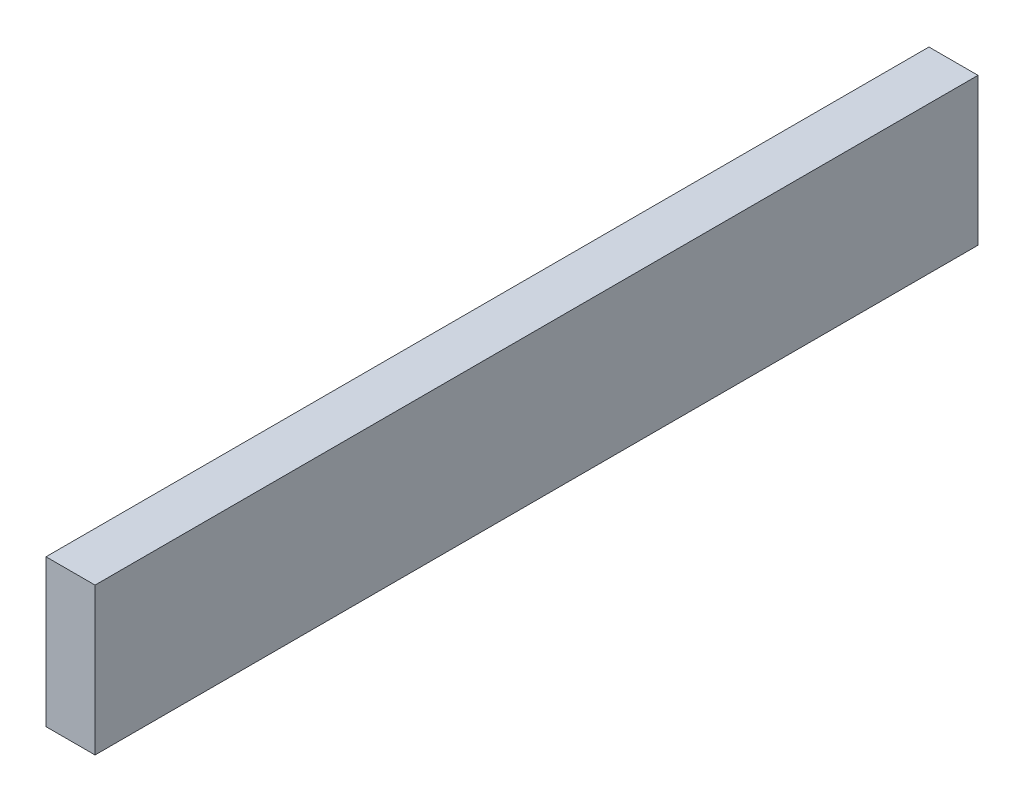
ISO-10303-21;
HEADER;
FILE_DESCRIPTION(('STEP AP214'),'2;1');
FILE_NAME('part.step','',(''),(''),'','','');
FILE_SCHEMA(('AUTOMOTIVE_DESIGN { 1 0 10303 214 1 1 1 1 }'));
ENDSEC;
DATA;
#1=APPLICATION_CONTEXT('core data for automotive mechanical design processes');
#2=APPLICATION_PROTOCOL_DEFINITION('international standard','automotive_design',2000,#1);
#3=PRODUCT_CONTEXT('',#1,'mechanical');
#4=PRODUCT('Part','Part','',(#3));
#5=PRODUCT_RELATED_PRODUCT_CATEGORY('part','',(#4));
#6=PRODUCT_DEFINITION_FORMATION('','',#4);
#7=PRODUCT_DEFINITION_CONTEXT('part definition',#1,'design');
#8=PRODUCT_DEFINITION('design','',#6,#7);
#9=PRODUCT_DEFINITION_SHAPE('','',#8);
#10=(LENGTH_UNIT() NAMED_UNIT(*) SI_UNIT(.MILLI.,.METRE.));
#11=(NAMED_UNIT(*) PLANE_ANGLE_UNIT() SI_UNIT($,.RADIAN.));
#12=(NAMED_UNIT(*) SI_UNIT($,.STERADIAN.) SOLID_ANGLE_UNIT());
#13=UNCERTAINTY_MEASURE_WITH_UNIT(LENGTH_MEASURE(1.E-05),#10,'distance_accuracy_value','');
#14=(GEOMETRIC_REPRESENTATION_CONTEXT(3) GLOBAL_UNCERTAINTY_ASSIGNED_CONTEXT((#13)) GLOBAL_UNIT_ASSIGNED_CONTEXT((#10,
#11,#12)) REPRESENTATION_CONTEXT('',''));
#15=CARTESIAN_POINT('',(0.,0.,0.));
#16=DIRECTION('',(0.,0.,1.));
#17=DIRECTION('',(1.,0.,0.));
#18=AXIS2_PLACEMENT_3D('',#15,#16,#17);
#19=CARTESIAN_POINT('',(-50.,2.22044604925031E-13,900.));
#20=DIRECTION('',(0.,-1.,0.));
#21=DIRECTION('',(0.,0.,-1.));
#22=AXIS2_PLACEMENT_3D('',#19,#20,#21);
#23=PLANE('',#22);
#24=DIRECTION('',(1.,0.,0.));
#25=VECTOR('',#24,1.);
#26=CARTESIAN_POINT('',(-50.,2.22044604925031E-13,-900.));
#27=LINE('',#26,#25);
#28=CARTESIAN_POINT('',(-50.,2.22044604925031E-13,-900.));
#29=VERTEX_POINT('',#28);
#30=CARTESIAN_POINT('',(50.,2.22044604925031E-13,-900.));
#31=VERTEX_POINT('',#30);
#32=EDGE_CURVE('E48',#29,#31,#27,.T.);
#33=ORIENTED_EDGE('',*,*,#32,.T.);
#34=DIRECTION('',(0.,0.,-1.));
#35=VECTOR('',#34,1.);
#36=CARTESIAN_POINT('',(50.,2.22044604925031E-13,900.));
#37=LINE('',#36,#35);
#38=CARTESIAN_POINT('',(50.,2.22044604925031E-13,900.));
#39=VERTEX_POINT('',#38);
#40=EDGE_CURVE('E86',#39,#31,#37,.T.);
#41=ORIENTED_EDGE('',*,*,#40,.F.);
#42=DIRECTION('',(1.,0.,0.));
#43=VECTOR('',#42,1.);
#44=CARTESIAN_POINT('',(-50.,2.22044604925031E-13,900.));
#45=LINE('',#44,#43);
#46=CARTESIAN_POINT('',(-50.,2.22044604925031E-13,900.));
#47=VERTEX_POINT('',#46);
#48=EDGE_CURVE('E11',#47,#39,#45,.T.);
#49=ORIENTED_EDGE('',*,*,#48,.F.);
#50=DIRECTION('',(0.,0.,-1.));
#51=VECTOR('',#50,1.);
#52=CARTESIAN_POINT('',(-50.,2.22044604925031E-13,900.));
#53=LINE('',#52,#51);
#54=EDGE_CURVE('E87',#47,#29,#53,.T.);
#55=ORIENTED_EDGE('',*,*,#54,.T.);
#56=EDGE_LOOP('',(#33,#41,#49,#55));
#57=FACE_BOUND('',#56,.T.);
#58=ADVANCED_FACE('F45',(#57),#23,.T.);
#59=CARTESIAN_POINT('',(-50.,2.22044604925031E-13,900.));
#60=DIRECTION('',(0.,0.,1.));
#61=DIRECTION('',(1.,0.,0.));
#62=AXIS2_PLACEMENT_3D('',#59,#60,#61);
#63=PLANE('',#62);
#64=ORIENTED_EDGE('',*,*,#48,.T.);
#65=DIRECTION('',(0.,-1.,0.));
#66=VECTOR('',#65,1.);
#67=CARTESIAN_POINT('',(50.,2.22044604925031E-13,900.));
#68=LINE('',#67,#66);
#69=CARTESIAN_POINT('',(50.,300.,900.));
#70=VERTEX_POINT('',#69);
#71=EDGE_CURVE('E105',#70,#39,#68,.T.);
#72=ORIENTED_EDGE('',*,*,#71,.F.);
#73=DIRECTION('',(1.,0.,0.));
#74=VECTOR('',#73,1.);
#75=CARTESIAN_POINT('',(-50.,300.,900.));
#76=LINE('',#75,#74);
#77=CARTESIAN_POINT('',(-50.,300.,900.));
#78=VERTEX_POINT('',#77);
#79=EDGE_CURVE('E54',#78,#70,#76,.T.);
#80=ORIENTED_EDGE('',*,*,#79,.F.);
#81=DIRECTION('',(0.,-1.,0.));
#82=VECTOR('',#81,1.);
#83=CARTESIAN_POINT('',(-50.,2.22044604925031E-13,900.));
#84=LINE('',#83,#82);
#85=EDGE_CURVE('E93',#78,#47,#84,.T.);
#86=ORIENTED_EDGE('',*,*,#85,.T.);
#87=EDGE_LOOP('',(#64,#72,#80,#86));
#88=FACE_BOUND('',#87,.T.);
#89=ADVANCED_FACE('F129',(#88),#63,.T.);
#90=CARTESIAN_POINT('',(-50.,300.,900.));
#91=DIRECTION('',(0.,1.,0.));
#92=DIRECTION('',(0.,0.,1.));
#93=AXIS2_PLACEMENT_3D('',#90,#91,#92);
#94=PLANE('',#93);
#95=ORIENTED_EDGE('',*,*,#79,.T.);
#96=DIRECTION('',(0.,0.,1.));
#97=VECTOR('',#96,1.);
#98=CARTESIAN_POINT('',(50.,300.,900.));
#99=LINE('',#98,#97);
#100=CARTESIAN_POINT('',(50.,300.,-900.));
#101=VERTEX_POINT('',#100);
#102=EDGE_CURVE('E101',#101,#70,#99,.T.);
#103=ORIENTED_EDGE('',*,*,#102,.F.);
#104=DIRECTION('',(1.,0.,0.));
#105=VECTOR('',#104,1.);
#106=CARTESIAN_POINT('',(-50.,300.,-900.));
#107=LINE('',#106,#105);
#108=CARTESIAN_POINT('',(-50.,300.,-900.));
#109=VERTEX_POINT('',#108);
#110=EDGE_CURVE('E92',#109,#101,#107,.T.);
#111=ORIENTED_EDGE('',*,*,#110,.F.);
#112=DIRECTION('',(0.,0.,1.));
#113=VECTOR('',#112,1.);
#114=CARTESIAN_POINT('',(-50.,300.,900.));
#115=LINE('',#114,#113);
#116=EDGE_CURVE('E118',#109,#78,#115,.T.);
#117=ORIENTED_EDGE('',*,*,#116,.T.);
#118=EDGE_LOOP('',(#95,#103,#111,#117));
#119=FACE_BOUND('',#118,.T.);
#120=ADVANCED_FACE('F126',(#119),#94,.T.);
#121=CARTESIAN_POINT('',(-50.,2.22044604925031E-13,-900.));
#122=DIRECTION('',(0.,0.,-1.));
#123=DIRECTION('',(-1.,0.,0.));
#124=AXIS2_PLACEMENT_3D('',#121,#122,#123);
#125=PLANE('',#124);
#126=ORIENTED_EDGE('',*,*,#110,.T.);
#127=DIRECTION('',(0.,1.,0.));
#128=VECTOR('',#127,1.);
#129=CARTESIAN_POINT('',(50.,2.22044604925031E-13,-900.));
#130=LINE('',#129,#128);
#131=EDGE_CURVE('E95',#31,#101,#130,.T.);
#132=ORIENTED_EDGE('',*,*,#131,.F.);
#133=ORIENTED_EDGE('',*,*,#32,.F.);
#134=DIRECTION('',(0.,1.,0.));
#135=VECTOR('',#134,1.);
#136=CARTESIAN_POINT('',(-50.,2.22044604925031E-13,-900.));
#137=LINE('',#136,#135);
#138=EDGE_CURVE('E115',#29,#109,#137,.T.);
#139=ORIENTED_EDGE('',*,*,#138,.T.);
#140=EDGE_LOOP('',(#126,#132,#133,#139));
#141=FACE_BOUND('',#140,.T.);
#142=ADVANCED_FACE('F96',(#141),#125,.T.);
#143=CARTESIAN_POINT('',(-50.,0.,0.));
#144=DIRECTION('',(1.,0.,0.));
#145=DIRECTION('',(0.,0.,-1.));
#146=AXIS2_PLACEMENT_3D('',#143,#144,#145);
#147=PLANE('',#146);
#148=ORIENTED_EDGE('',*,*,#54,.F.);
#149=ORIENTED_EDGE('',*,*,#85,.F.);
#150=ORIENTED_EDGE('',*,*,#116,.F.);
#151=ORIENTED_EDGE('',*,*,#138,.F.);
#152=EDGE_LOOP('',(#148,#149,#150,#151));
#153=FACE_BOUND('',#152,.T.);
#154=ADVANCED_FACE('F131',(#153),#147,.F.);
#155=CARTESIAN_POINT('',(50.,0.,0.));
#156=DIRECTION('',(1.,0.,0.));
#157=DIRECTION('',(0.,0.,-1.));
#158=AXIS2_PLACEMENT_3D('',#155,#156,#157);
#159=PLANE('',#158);
#160=ORIENTED_EDGE('',*,*,#40,.T.);
#161=ORIENTED_EDGE('',*,*,#131,.T.);
#162=ORIENTED_EDGE('',*,*,#102,.T.);
#163=ORIENTED_EDGE('',*,*,#71,.T.);
#164=EDGE_LOOP('',(#160,#161,#162,#163));
#165=FACE_BOUND('',#164,.T.);
#166=ADVANCED_FACE('F104',(#165),#159,.T.);
#167=CLOSED_SHELL('',(#58,#89,#120,#142,#154,#166));
#168=MANIFOLD_SOLID_BREP('B2',#167);
#169=ADVANCED_BREP_SHAPE_REPRESENTATION('',(#18,#168),#14);
#170=SHAPE_DEFINITION_REPRESENTATION(#9,#169);
ENDSEC;
END-ISO-10303-21;
